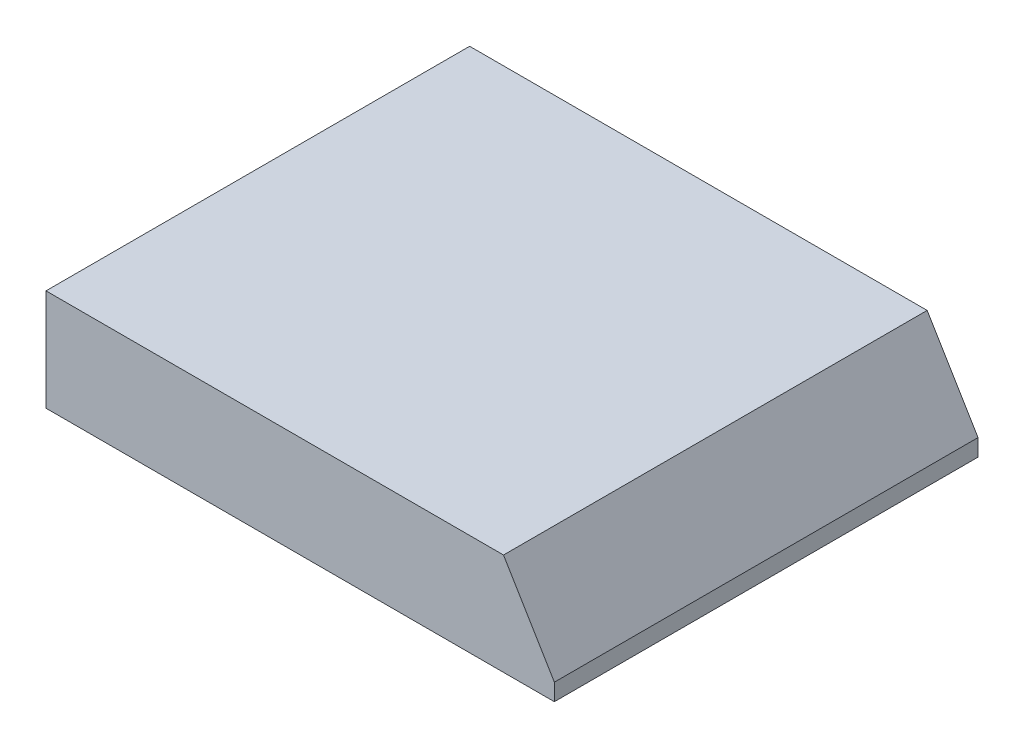
ISO-10303-21;
HEADER;
FILE_DESCRIPTION(('STEP AP214'),'2;1');
FILE_NAME('part.step','',(''),(''),'','','');
FILE_SCHEMA(('AUTOMOTIVE_DESIGN { 1 0 10303 214 1 1 1 1 }'));
ENDSEC;
DATA;
#1=APPLICATION_CONTEXT('core data for automotive mechanical design processes');
#2=APPLICATION_PROTOCOL_DEFINITION('international standard','automotive_design',2000,#1);
#3=PRODUCT_CONTEXT('',#1,'mechanical');
#4=PRODUCT('Part','Part','',(#3));
#5=PRODUCT_RELATED_PRODUCT_CATEGORY('part','',(#4));
#6=PRODUCT_DEFINITION_FORMATION('','',#4);
#7=PRODUCT_DEFINITION_CONTEXT('part definition',#1,'design');
#8=PRODUCT_DEFINITION('design','',#6,#7);
#9=PRODUCT_DEFINITION_SHAPE('','',#8);
#10=(LENGTH_UNIT() NAMED_UNIT(*) SI_UNIT(.MILLI.,.METRE.));
#11=(NAMED_UNIT(*) PLANE_ANGLE_UNIT() SI_UNIT($,.RADIAN.));
#12=(NAMED_UNIT(*) SI_UNIT($,.STERADIAN.) SOLID_ANGLE_UNIT());
#13=UNCERTAINTY_MEASURE_WITH_UNIT(LENGTH_MEASURE(1.E-05),#10,'distance_accuracy_value','');
#14=(GEOMETRIC_REPRESENTATION_CONTEXT(3) GLOBAL_UNCERTAINTY_ASSIGNED_CONTEXT((#13)) GLOBAL_UNIT_ASSIGNED_CONTEXT((#10,
#11,#12)) REPRESENTATION_CONTEXT('',''));
#15=CARTESIAN_POINT('',(0.,0.,0.));
#16=DIRECTION('',(0.,0.,1.));
#17=DIRECTION('',(1.,0.,0.));
#18=AXIS2_PLACEMENT_3D('',#15,#16,#17);
#19=CARTESIAN_POINT('',(0.,0.,50.));
#20=DIRECTION('',(1.,0.,0.));
#21=DIRECTION('',(0.,0.,-1.));
#22=AXIS2_PLACEMENT_3D('',#19,#20,#21);
#23=PLANE('',#22);
#24=DIRECTION('',(0.,-1.,0.));
#25=VECTOR('',#24,1.);
#26=CARTESIAN_POINT('',(0.,0.,0.));
#27=LINE('',#26,#25);
#28=CARTESIAN_POINT('',(0.,12.,0.));
#29=VERTEX_POINT('',#28);
#30=CARTESIAN_POINT('',(0.,0.,0.));
#31=VERTEX_POINT('',#30);
#32=EDGE_CURVE('E112',#29,#31,#27,.T.);
#33=ORIENTED_EDGE('',*,*,#32,.T.);
#34=DIRECTION('',(0.,0.,-1.));
#35=VECTOR('',#34,1.);
#36=CARTESIAN_POINT('',(0.,0.,50.));
#37=LINE('',#36,#35);
#38=CARTESIAN_POINT('',(0.,0.,50.));
#39=VERTEX_POINT('',#38);
#40=EDGE_CURVE('E11',#39,#31,#37,.T.);
#41=ORIENTED_EDGE('',*,*,#40,.F.);
#42=DIRECTION('',(0.,-1.,0.));
#43=VECTOR('',#42,1.);
#44=CARTESIAN_POINT('',(0.,0.,50.));
#45=LINE('',#44,#43);
#46=CARTESIAN_POINT('',(0.,12.,50.));
#47=VERTEX_POINT('',#46);
#48=EDGE_CURVE('E114',#47,#39,#45,.T.);
#49=ORIENTED_EDGE('',*,*,#48,.F.);
#50=DIRECTION('',(0.,0.,-1.));
#51=VECTOR('',#50,1.);
#52=CARTESIAN_POINT('',(0.,12.,50.));
#53=LINE('',#52,#51);
#54=EDGE_CURVE('E124',#47,#29,#53,.T.);
#55=ORIENTED_EDGE('',*,*,#54,.T.);
#56=EDGE_LOOP('',(#33,#41,#49,#55));
#57=FACE_BOUND('',#56,.T.);
#58=ADVANCED_FACE('F43',(#57),#23,.F.);
#59=CARTESIAN_POINT('',(0.,0.,50.));
#60=DIRECTION('',(0.,1.,0.));
#61=DIRECTION('',(0.,0.,1.));
#62=AXIS2_PLACEMENT_3D('',#59,#60,#61);
#63=PLANE('',#62);
#64=DIRECTION('',(1.,0.,0.));
#65=VECTOR('',#64,1.);
#66=CARTESIAN_POINT('',(0.,0.,0.));
#67=LINE('',#66,#65);
#68=CARTESIAN_POINT('',(60.,0.,0.));
#69=VERTEX_POINT('',#68);
#70=EDGE_CURVE('E120',#31,#69,#67,.T.);
#71=ORIENTED_EDGE('',*,*,#70,.T.);
#72=DIRECTION('',(0.,0.,-1.));
#73=VECTOR('',#72,1.);
#74=CARTESIAN_POINT('',(60.,0.,50.));
#75=LINE('',#74,#73);
#76=CARTESIAN_POINT('',(60.,0.,50.));
#77=VERTEX_POINT('',#76);
#78=EDGE_CURVE('E51',#77,#69,#75,.T.);
#79=ORIENTED_EDGE('',*,*,#78,.F.);
#80=DIRECTION('',(1.,0.,0.));
#81=VECTOR('',#80,1.);
#82=CARTESIAN_POINT('',(0.,0.,50.));
#83=LINE('',#82,#81);
#84=EDGE_CURVE('E90',#39,#77,#83,.T.);
#85=ORIENTED_EDGE('',*,*,#84,.F.);
#86=ORIENTED_EDGE('',*,*,#40,.T.);
#87=EDGE_LOOP('',(#71,#79,#85,#86));
#88=FACE_BOUND('',#87,.T.);
#89=ADVANCED_FACE('F135',(#88),#63,.F.);
#90=CARTESIAN_POINT('',(60.,0.,50.));
#91=DIRECTION('',(-1.,0.,0.));
#92=DIRECTION('',(0.,0.,1.));
#93=AXIS2_PLACEMENT_3D('',#90,#91,#92);
#94=PLANE('',#93);
#95=DIRECTION('',(0.,1.,0.));
#96=VECTOR('',#95,1.);
#97=CARTESIAN_POINT('',(60.,0.,0.));
#98=LINE('',#97,#96);
#99=CARTESIAN_POINT('',(60.,1.99999999999995,0.));
#100=VERTEX_POINT('',#99);
#101=EDGE_CURVE('E115',#69,#100,#98,.T.);
#102=ORIENTED_EDGE('',*,*,#101,.T.);
#103=DIRECTION('',(0.,0.,1.));
#104=VECTOR('',#103,1.);
#105=CARTESIAN_POINT('',(60.,2.,0.));
#106=LINE('',#105,#104);
#107=CARTESIAN_POINT('',(60.,2.,50.));
#108=VERTEX_POINT('',#107);
#109=EDGE_CURVE('E58',#100,#108,#106,.T.);
#110=ORIENTED_EDGE('',*,*,#109,.T.);
#111=DIRECTION('',(0.,1.,0.));
#112=VECTOR('',#111,1.);
#113=CARTESIAN_POINT('',(60.,0.,50.));
#114=LINE('',#113,#112);
#115=EDGE_CURVE('E132',#77,#108,#114,.T.);
#116=ORIENTED_EDGE('',*,*,#115,.F.);
#117=ORIENTED_EDGE('',*,*,#78,.T.);
#118=EDGE_LOOP('',(#102,#110,#116,#117));
#119=FACE_BOUND('',#118,.T.);
#120=ADVANCED_FACE('F130',(#119),#94,.F.);
#121=CARTESIAN_POINT('',(0.,12.,50.));
#122=DIRECTION('',(0.,-1.,0.));
#123=DIRECTION('',(0.,0.,-1.));
#124=AXIS2_PLACEMENT_3D('',#121,#122,#123);
#125=PLANE('',#124);
#126=DIRECTION('',(-1.,0.,0.));
#127=VECTOR('',#126,1.);
#128=CARTESIAN_POINT('',(0.,12.,50.));
#129=LINE('',#128,#127);
#130=CARTESIAN_POINT('',(54.,12.,50.));
#131=VERTEX_POINT('',#130);
#132=EDGE_CURVE('E67',#131,#47,#129,.T.);
#133=ORIENTED_EDGE('',*,*,#132,.F.);
#134=DIRECTION('',(0.,0.,1.));
#135=VECTOR('',#134,1.);
#136=CARTESIAN_POINT('',(54.,12.,0.));
#137=LINE('',#136,#135);
#138=CARTESIAN_POINT('',(54.,12.,0.));
#139=VERTEX_POINT('',#138);
#140=EDGE_CURVE('E99',#139,#131,#137,.T.);
#141=ORIENTED_EDGE('',*,*,#140,.F.);
#142=DIRECTION('',(-1.,0.,0.));
#143=VECTOR('',#142,1.);
#144=CARTESIAN_POINT('',(0.,12.,0.));
#145=LINE('',#144,#143);
#146=EDGE_CURVE('E85',#139,#29,#145,.T.);
#147=ORIENTED_EDGE('',*,*,#146,.T.);
#148=ORIENTED_EDGE('',*,*,#54,.F.);
#149=EDGE_LOOP('',(#133,#141,#147,#148));
#150=FACE_BOUND('',#149,.T.);
#151=ADVANCED_FACE('F106',(#150),#125,.F.);
#152=CARTESIAN_POINT('',(0.,0.,50.));
#153=DIRECTION('',(0.,0.,-1.));
#154=DIRECTION('',(-1.,0.,0.));
#155=AXIS2_PLACEMENT_3D('',#152,#153,#154);
#156=PLANE('',#155);
#157=ORIENTED_EDGE('',*,*,#115,.T.);
#158=DIRECTION('',(0.514495755427526,-0.857492925712544,0.));
#159=VECTOR('',#158,1.);
#160=CARTESIAN_POINT('',(54.,12.,50.));
#161=LINE('',#160,#159);
#162=EDGE_CURVE('E104',#131,#108,#161,.T.);
#163=ORIENTED_EDGE('',*,*,#162,.F.);
#164=ORIENTED_EDGE('',*,*,#132,.T.);
#165=ORIENTED_EDGE('',*,*,#48,.T.);
#166=ORIENTED_EDGE('',*,*,#84,.T.);
#167=EDGE_LOOP('',(#157,#163,#164,#165,#166));
#168=FACE_BOUND('',#167,.T.);
#169=ADVANCED_FACE('F150',(#168),#156,.F.);
#170=CARTESIAN_POINT('',(0.,0.,0.));
#171=DIRECTION('',(0.,0.,-1.));
#172=DIRECTION('',(-1.,0.,0.));
#173=AXIS2_PLACEMENT_3D('',#170,#171,#172);
#174=PLANE('',#173);
#175=DIRECTION('',(0.514495755427526,-0.857492925712544,0.));
#176=VECTOR('',#175,1.);
#177=CARTESIAN_POINT('',(54.,12.,0.));
#178=LINE('',#177,#176);
#179=EDGE_CURVE('E97',#139,#100,#178,.T.);
#180=ORIENTED_EDGE('',*,*,#179,.T.);
#181=ORIENTED_EDGE('',*,*,#101,.F.);
#182=ORIENTED_EDGE('',*,*,#70,.F.);
#183=ORIENTED_EDGE('',*,*,#32,.F.);
#184=ORIENTED_EDGE('',*,*,#146,.F.);
#185=EDGE_LOOP('',(#180,#181,#182,#183,#184));
#186=FACE_BOUND('',#185,.T.);
#187=ADVANCED_FACE('F110',(#186),#174,.T.);
#188=CARTESIAN_POINT('',(54.,12.,0.));
#189=DIRECTION('',(-0.857492925712544,-0.514495755427526,0.));
#190=DIRECTION('',(0.514495755427526,-0.857492925712544,0.));
#191=AXIS2_PLACEMENT_3D('',#188,#189,#190);
#192=PLANE('',#191);
#193=ORIENTED_EDGE('',*,*,#162,.T.);
#194=ORIENTED_EDGE('',*,*,#109,.F.);
#195=ORIENTED_EDGE('',*,*,#179,.F.);
#196=ORIENTED_EDGE('',*,*,#140,.T.);
#197=EDGE_LOOP('',(#193,#194,#195,#196));
#198=FACE_BOUND('',#197,.T.);
#199=ADVANCED_FACE('F98',(#198),#192,.F.);
#200=CLOSED_SHELL('',(#58,#89,#120,#151,#169,#187,#199));
#201=MANIFOLD_SOLID_BREP('B2',#200);
#202=ADVANCED_BREP_SHAPE_REPRESENTATION('',(#18,#201),#14);
#203=SHAPE_DEFINITION_REPRESENTATION(#9,#202);
ENDSEC;
END-ISO-10303-21;
